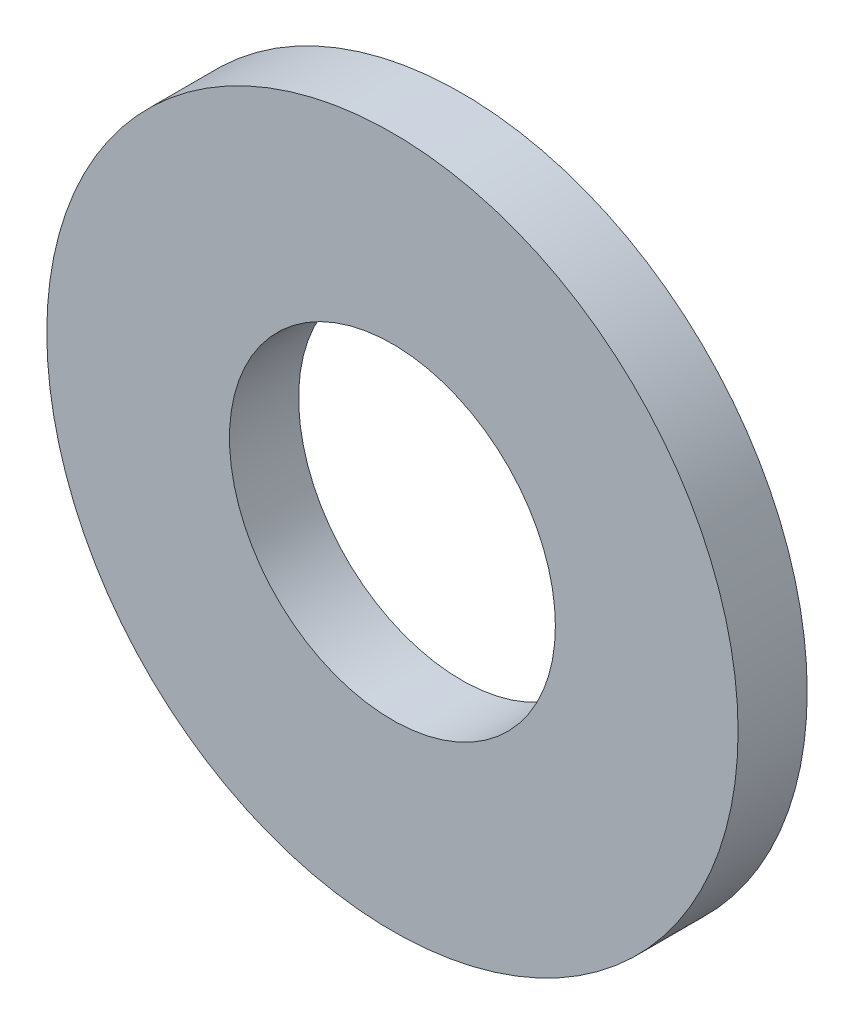
ISO-10303-21;
HEADER;
FILE_DESCRIPTION(('STEP AP214'),'2;1');
FILE_NAME('part.step','',(''),(''),'','','');
FILE_SCHEMA(('AUTOMOTIVE_DESIGN { 1 0 10303 214 1 1 1 1 }'));
ENDSEC;
DATA;
#1=APPLICATION_CONTEXT('core data for automotive mechanical design processes');
#2=APPLICATION_PROTOCOL_DEFINITION('international standard','automotive_design',2000,#1);
#3=PRODUCT_CONTEXT('',#1,'mechanical');
#4=PRODUCT('Part','Part','',(#3));
#5=PRODUCT_RELATED_PRODUCT_CATEGORY('part','',(#4));
#6=PRODUCT_DEFINITION_FORMATION('','',#4);
#7=PRODUCT_DEFINITION_CONTEXT('part definition',#1,'design');
#8=PRODUCT_DEFINITION('design','',#6,#7);
#9=PRODUCT_DEFINITION_SHAPE('','',#8);
#10=(LENGTH_UNIT() NAMED_UNIT(*) SI_UNIT(.MILLI.,.METRE.));
#11=(NAMED_UNIT(*) PLANE_ANGLE_UNIT() SI_UNIT($,.RADIAN.));
#12=(NAMED_UNIT(*) SI_UNIT($,.STERADIAN.) SOLID_ANGLE_UNIT());
#13=UNCERTAINTY_MEASURE_WITH_UNIT(LENGTH_MEASURE(1.E-05),#10,'distance_accuracy_value','');
#14=(GEOMETRIC_REPRESENTATION_CONTEXT(3) GLOBAL_UNCERTAINTY_ASSIGNED_CONTEXT((#13)) GLOBAL_UNIT_ASSIGNED_CONTEXT((#10,
#11,#12)) REPRESENTATION_CONTEXT('',''));
#15=CARTESIAN_POINT('',(0.,0.,0.));
#16=DIRECTION('',(0.,0.,1.));
#17=DIRECTION('',(1.,0.,0.));
#18=AXIS2_PLACEMENT_3D('',#15,#16,#17);
#19=CARTESIAN_POINT('',(0.,0.,0.7));
#20=DIRECTION('',(0.,0.,1.));
#21=DIRECTION('',(1.,0.,0.));
#22=AXIS2_PLACEMENT_3D('',#19,#20,#21);
#23=PLANE('',#22);
#24=CARTESIAN_POINT('',(0.,0.,0.7));
#25=DIRECTION('',(0.,0.,1.));
#26=DIRECTION('',(1.,0.,0.));
#27=AXIS2_PLACEMENT_3D('',#24,#25,#26);
#28=CIRCLE('',#27,3.5);
#29=CARTESIAN_POINT('',(3.5,0.,0.7));
#30=VERTEX_POINT('',#29);
#31=EDGE_CURVE('E10',#30,#30,#28,.T.);
#32=ORIENTED_EDGE('',*,*,#31,.T.);
#33=EDGE_LOOP('',(#32));
#34=FACE_BOUND('',#33,.T.);
#35=CARTESIAN_POINT('',(0.,0.,0.7));
#36=DIRECTION('',(0.,0.,1.));
#37=DIRECTION('',(1.,0.,0.));
#38=AXIS2_PLACEMENT_3D('',#35,#36,#37);
#39=CIRCLE('',#38,1.65);
#40=CARTESIAN_POINT('',(1.65,0.,0.7));
#41=VERTEX_POINT('',#40);
#42=EDGE_CURVE('E42',#41,#41,#39,.T.);
#43=ORIENTED_EDGE('',*,*,#42,.F.);
#44=EDGE_LOOP('',(#43));
#45=FACE_BOUND('',#44,.T.);
#46=ADVANCED_FACE('F31',(#34,#45),#23,.T.);
#47=CARTESIAN_POINT('',(0.,0.,0.));
#48=DIRECTION('',(0.,0.,1.));
#49=DIRECTION('',(1.,0.,0.));
#50=AXIS2_PLACEMENT_3D('',#47,#48,#49);
#51=PLANE('',#50);
#52=CARTESIAN_POINT('',(0.,0.,0.));
#53=DIRECTION('',(0.,0.,1.));
#54=DIRECTION('',(1.,0.,0.));
#55=AXIS2_PLACEMENT_3D('',#52,#53,#54);
#56=CIRCLE('',#55,3.5);
#57=CARTESIAN_POINT('',(3.5,0.,0.));
#58=VERTEX_POINT('',#57);
#59=EDGE_CURVE('E35',#58,#58,#56,.T.);
#60=ORIENTED_EDGE('',*,*,#59,.F.);
#61=EDGE_LOOP('',(#60));
#62=FACE_BOUND('',#61,.T.);
#63=CARTESIAN_POINT('',(0.,0.,0.));
#64=DIRECTION('',(0.,0.,1.));
#65=DIRECTION('',(1.,0.,0.));
#66=AXIS2_PLACEMENT_3D('',#63,#64,#65);
#67=CIRCLE('',#66,1.65);
#68=CARTESIAN_POINT('',(1.65,0.,0.));
#69=VERTEX_POINT('',#68);
#70=EDGE_CURVE('E44',#69,#69,#67,.T.);
#71=ORIENTED_EDGE('',*,*,#70,.T.);
#72=EDGE_LOOP('',(#71));
#73=FACE_BOUND('',#72,.T.);
#74=ADVANCED_FACE('F54',(#62,#73),#51,.F.);
#75=CARTESIAN_POINT('',(0.,0.,0.7));
#76=DIRECTION('',(0.,0.,-1.));
#77=DIRECTION('',(-1.,0.,0.));
#78=AXIS2_PLACEMENT_3D('',#75,#76,#77);
#79=CYLINDRICAL_SURFACE('',#78,3.5);
#80=ORIENTED_EDGE('',*,*,#31,.F.);
#81=EDGE_LOOP('',(#80));
#82=FACE_BOUND('',#81,.T.);
#83=ORIENTED_EDGE('',*,*,#59,.T.);
#84=EDGE_LOOP('',(#83));
#85=FACE_BOUND('',#84,.T.);
#86=ADVANCED_FACE('F33',(#82,#85),#79,.T.);
#87=CARTESIAN_POINT('',(0.,0.,0.7));
#88=DIRECTION('',(0.,0.,-1.));
#89=DIRECTION('',(-1.,0.,0.));
#90=AXIS2_PLACEMENT_3D('',#87,#88,#89);
#91=CYLINDRICAL_SURFACE('',#90,1.65);
#92=ORIENTED_EDGE('',*,*,#42,.T.);
#93=EDGE_LOOP('',(#92));
#94=FACE_BOUND('',#93,.T.);
#95=ORIENTED_EDGE('',*,*,#70,.F.);
#96=EDGE_LOOP('',(#95));
#97=FACE_BOUND('',#96,.T.);
#98=ADVANCED_FACE('F50',(#94,#97),#91,.F.);
#99=CLOSED_SHELL('',(#46,#74,#86,#98));
#100=MANIFOLD_SOLID_BREP('B2',#99);
#101=ADVANCED_BREP_SHAPE_REPRESENTATION('',(#18,#100),#14);
#102=SHAPE_DEFINITION_REPRESENTATION(#9,#101);
ENDSEC;
END-ISO-10303-21;
